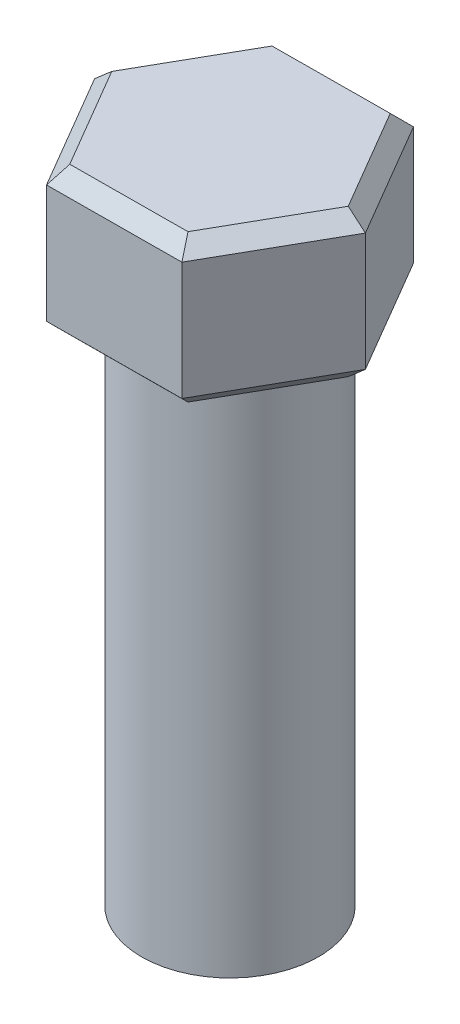
ISO-10303-21;
HEADER;
FILE_DESCRIPTION(('STEP AP214'),'2;1');
FILE_NAME('part.step','',(''),(''),'','','');
FILE_SCHEMA(('AUTOMOTIVE_DESIGN { 1 0 10303 214 1 1 1 1 }'));
ENDSEC;
DATA;
#1=APPLICATION_CONTEXT('core data for automotive mechanical design processes');
#2=APPLICATION_PROTOCOL_DEFINITION('international standard','automotive_design',2000,#1);
#3=PRODUCT_CONTEXT('',#1,'mechanical');
#4=PRODUCT('Part','Part','',(#3));
#5=PRODUCT_RELATED_PRODUCT_CATEGORY('part','',(#4));
#6=PRODUCT_DEFINITION_FORMATION('','',#4);
#7=PRODUCT_DEFINITION_CONTEXT('part definition',#1,'design');
#8=PRODUCT_DEFINITION('design','',#6,#7);
#9=PRODUCT_DEFINITION_SHAPE('','',#8);
#10=(LENGTH_UNIT() NAMED_UNIT(*) SI_UNIT(.MILLI.,.METRE.));
#11=(NAMED_UNIT(*) PLANE_ANGLE_UNIT() SI_UNIT($,.RADIAN.));
#12=(NAMED_UNIT(*) SI_UNIT($,.STERADIAN.) SOLID_ANGLE_UNIT());
#13=UNCERTAINTY_MEASURE_WITH_UNIT(LENGTH_MEASURE(1.E-05),#10,'distance_accuracy_value','');
#14=(GEOMETRIC_REPRESENTATION_CONTEXT(3) GLOBAL_UNCERTAINTY_ASSIGNED_CONTEXT((#13)) GLOBAL_UNIT_ASSIGNED_CONTEXT((#10,
#11,#12)) REPRESENTATION_CONTEXT('',''));
#15=CARTESIAN_POINT('',(0.,0.,0.));
#16=DIRECTION('',(0.,0.,1.));
#17=DIRECTION('',(1.,0.,0.));
#18=AXIS2_PLACEMENT_3D('',#15,#16,#17);
#19=CARTESIAN_POINT('',(0.,35.,0.));
#20=DIRECTION('',(0.,-1.,0.));
#21=DIRECTION('',(0.,0.,-1.));
#22=AXIS2_PLACEMENT_3D('',#19,#20,#21);
#23=CYLINDRICAL_SURFACE('',#22,6.);
#24=CARTESIAN_POINT('',(0.,35.,0.));
#25=DIRECTION('',(0.,1.,0.));
#26=DIRECTION('',(0.,0.,1.));
#27=AXIS2_PLACEMENT_3D('',#24,#25,#26);
#28=CIRCLE('',#27,6.);
#29=CARTESIAN_POINT('',(0.,35.,6.));
#30=VERTEX_POINT('',#29);
#31=EDGE_CURVE('E159',#30,#30,#28,.T.);
#32=ORIENTED_EDGE('',*,*,#31,.F.);
#33=EDGE_LOOP('',(#32));
#34=FACE_BOUND('',#33,.T.);
#35=CARTESIAN_POINT('',(0.,0.,0.));
#36=DIRECTION('',(0.,1.,0.));
#37=DIRECTION('',(0.,0.,1.));
#38=AXIS2_PLACEMENT_3D('',#35,#36,#37);
#39=CIRCLE('',#38,6.);
#40=CARTESIAN_POINT('',(0.,0.,6.));
#41=VERTEX_POINT('',#40);
#42=EDGE_CURVE('E230',#41,#41,#39,.T.);
#43=ORIENTED_EDGE('',*,*,#42,.T.);
#44=EDGE_LOOP('',(#43));
#45=FACE_BOUND('',#44,.T.);
#46=ADVANCED_FACE('F38',(#34,#45),#23,.T.);
#47=CARTESIAN_POINT('',(0.,0.,0.));
#48=DIRECTION('',(0.,1.,0.));
#49=DIRECTION('',(0.,0.,1.));
#50=AXIS2_PLACEMENT_3D('',#47,#48,#49);
#51=PLANE('',#50);
#52=ORIENTED_EDGE('',*,*,#42,.F.);
#53=EDGE_LOOP('',(#52));
#54=FACE_BOUND('',#53,.T.);
#55=ADVANCED_FACE('F308',(#54),#51,.F.);
#56=CARTESIAN_POINT('',(-4.50847310254012,45.,7.92363547695499));
#57=DIRECTION('',(-0.00629250078287666,0.,-0.999980202020969));
#58=DIRECTION('',(-0.999980202020969,0.,0.00629250078287666));
#59=AXIS2_PLACEMENT_3D('',#56,#57,#58);
#60=PLANE('',#59);
#61=DIRECTION('',(0.,-1.,0.));
#62=VECTOR('',#61,1.);
#63=CARTESIAN_POINT('',(-4.50847310254012,45.,7.92363547695499));
#64=LINE('',#63,#62);
#65=CARTESIAN_POINT('',(-4.50847310254012,44.,7.92363547695499));
#66=VERTEX_POINT('',#65);
#67=CARTESIAN_POINT('',(-4.50847310254012,36.,7.92363547695499));
#68=VERTEX_POINT('',#67);
#69=EDGE_CURVE('E180',#66,#68,#64,.T.);
#70=ORIENTED_EDGE('',*,*,#69,.T.);
#71=DIRECTION('',(0.999980202020969,0.,-0.00629250078287666));
#72=VECTOR('',#71,1.);
#73=CARTESIAN_POINT('',(-4.50847310254012,36.,7.92363547695499));
#74=LINE('',#73,#72);
#75=CARTESIAN_POINT('',(4.60783306210058,36.,7.86626997755609));
#76=VERTEX_POINT('',#75);
#77=EDGE_CURVE('E199',#68,#76,#74,.T.);
#78=ORIENTED_EDGE('',*,*,#77,.T.);
#79=DIRECTION('',(0.,-1.,0.));
#80=VECTOR('',#79,1.);
#81=CARTESIAN_POINT('',(4.60783306210058,45.,7.86626997755609));
#82=LINE('',#81,#80);
#83=CARTESIAN_POINT('',(4.60783306210058,44.,7.86626997755609));
#84=VERTEX_POINT('',#83);
#85=EDGE_CURVE('E150',#84,#76,#82,.T.);
#86=ORIENTED_EDGE('',*,*,#85,.F.);
#87=DIRECTION('',(-0.999980202020969,0.,0.00629250078287666));
#88=VECTOR('',#87,1.);
#89=CARTESIAN_POINT('',(-4.50847310254012,44.,7.92363547695499));
#90=LINE('',#89,#88);
#91=EDGE_CURVE('E201',#84,#66,#90,.T.);
#92=ORIENTED_EDGE('',*,*,#91,.T.);
#93=EDGE_LOOP('',(#70,#78,#86,#92));
#94=FACE_BOUND('',#93,.T.);
#95=ADVANCED_FACE('F247',(#94),#60,.F.);
#96=CARTESIAN_POINT('',(4.60783306210058,45.,7.86626997755609));
#97=DIRECTION('',(-0.869154508623093,0.,-0.494540635479179));
#98=DIRECTION('',(-0.494540635479179,0.,0.869154508623093));
#99=AXIS2_PLACEMENT_3D('',#96,#97,#98);
#100=PLANE('',#99);
#101=ORIENTED_EDGE('',*,*,#85,.T.);
#102=DIRECTION('',(0.494540635479179,0.,-0.869154508623093));
#103=VECTOR('',#102,1.);
#104=CARTESIAN_POINT('',(4.60783306210058,36.,7.86626997755609));
#105=LINE('',#104,#103);
#106=CARTESIAN_POINT('',(9.1163061646407,36.,-0.0573654993989019));
#107=VERTEX_POINT('',#106);
#108=EDGE_CURVE('E149',#76,#107,#105,.T.);
#109=ORIENTED_EDGE('',*,*,#108,.T.);
#110=DIRECTION('',(0.,-1.,0.));
#111=VECTOR('',#110,1.);
#112=CARTESIAN_POINT('',(9.1163061646407,45.,-0.0573654993989019));
#113=LINE('',#112,#111);
#114=CARTESIAN_POINT('',(9.1163061646407,44.,-0.0573654993989019));
#115=VERTEX_POINT('',#114);
#116=EDGE_CURVE('E132',#115,#107,#113,.T.);
#117=ORIENTED_EDGE('',*,*,#116,.F.);
#118=DIRECTION('',(-0.494540635479179,0.,0.869154508623093));
#119=VECTOR('',#118,1.);
#120=CARTESIAN_POINT('',(4.60783306210058,44.,7.86626997755609));
#121=LINE('',#120,#119);
#122=EDGE_CURVE('E146',#115,#84,#121,.T.);
#123=ORIENTED_EDGE('',*,*,#122,.T.);
#124=EDGE_LOOP('',(#101,#109,#117,#123));
#125=FACE_BOUND('',#124,.T.);
#126=ADVANCED_FACE('F145',(#125),#100,.F.);
#127=CARTESIAN_POINT('',(9.1163061646407,45.,-0.0573654993989019));
#128=DIRECTION('',(-0.862862007840215,0.,0.505439566541789));
#129=DIRECTION('',(0.505439566541789,0.,0.862862007840215));
#130=AXIS2_PLACEMENT_3D('',#127,#128,#129);
#131=PLANE('',#130);
#132=ORIENTED_EDGE('',*,*,#116,.T.);
#133=DIRECTION('',(-0.505439566541789,0.,-0.862862007840215));
#134=VECTOR('',#133,1.);
#135=CARTESIAN_POINT('',(9.1163061646407,36.,-0.0573654993989019));
#136=LINE('',#135,#134);
#137=CARTESIAN_POINT('',(4.50847310254012,36.,-7.92363547695499));
#138=VERTEX_POINT('',#137);
#139=EDGE_CURVE('E138',#107,#138,#136,.T.);
#140=ORIENTED_EDGE('',*,*,#139,.T.);
#141=DIRECTION('',(0.,-1.,0.));
#142=VECTOR('',#141,1.);
#143=CARTESIAN_POINT('',(4.50847310254012,45.,-7.92363547695499));
#144=LINE('',#143,#142);
#145=CARTESIAN_POINT('',(4.50847310254012,44.,-7.92363547695499));
#146=VERTEX_POINT('',#145);
#147=EDGE_CURVE('E134',#146,#138,#144,.T.);
#148=ORIENTED_EDGE('',*,*,#147,.F.);
#149=DIRECTION('',(0.505439566541789,0.,0.862862007840215));
#150=VECTOR('',#149,1.);
#151=CARTESIAN_POINT('',(9.1163061646407,44.,-0.057365499398902));
#152=LINE('',#151,#150);
#153=EDGE_CURVE('E129',#146,#115,#152,.T.);
#154=ORIENTED_EDGE('',*,*,#153,.T.);
#155=EDGE_LOOP('',(#132,#140,#148,#154));
#156=FACE_BOUND('',#155,.T.);
#157=ADVANCED_FACE('F131',(#156),#131,.F.);
#158=CARTESIAN_POINT('',(4.50847310254012,45.,-7.92363547695499));
#159=DIRECTION('',(0.00629250078287704,0.,0.999980202020969));
#160=DIRECTION('',(0.999980202020969,0.,-0.00629250078287704));
#161=AXIS2_PLACEMENT_3D('',#158,#159,#160);
#162=PLANE('',#161);
#163=ORIENTED_EDGE('',*,*,#147,.T.);
#164=DIRECTION('',(-0.999980202020969,0.,0.00629250078287704));
#165=VECTOR('',#164,1.);
#166=CARTESIAN_POINT('',(4.50847310254012,36.,-7.92363547695499));
#167=LINE('',#166,#165);
#168=CARTESIAN_POINT('',(-4.60783306210058,36.,-7.86626997755608));
#169=VERTEX_POINT('',#168);
#170=EDGE_CURVE('E212',#138,#169,#167,.T.);
#171=ORIENTED_EDGE('',*,*,#170,.T.);
#172=DIRECTION('',(0.,-1.,0.));
#173=VECTOR('',#172,1.);
#174=CARTESIAN_POINT('',(-4.60783306210058,45.,-7.86626997755608));
#175=LINE('',#174,#173);
#176=CARTESIAN_POINT('',(-4.60783306210058,44.,-7.86626997755608));
#177=VERTEX_POINT('',#176);
#178=EDGE_CURVE('E237',#177,#169,#175,.T.);
#179=ORIENTED_EDGE('',*,*,#178,.F.);
#180=DIRECTION('',(0.999980202020969,0.,-0.00629250078287704));
#181=VECTOR('',#180,1.);
#182=CARTESIAN_POINT('',(4.50847310254012,44.,-7.92363547695499));
#183=LINE('',#182,#181);
#184=EDGE_CURVE('E214',#177,#146,#183,.T.);
#185=ORIENTED_EDGE('',*,*,#184,.T.);
#186=EDGE_LOOP('',(#163,#171,#179,#185));
#187=FACE_BOUND('',#186,.T.);
#188=ADVANCED_FACE('F270',(#187),#162,.F.);
#189=CARTESIAN_POINT('',(-4.60783306210058,45.,-7.86626997755608));
#190=DIRECTION('',(0.869154508623093,0.,0.494540635479179));
#191=DIRECTION('',(0.494540635479179,0.,-0.869154508623093));
#192=AXIS2_PLACEMENT_3D('',#189,#190,#191);
#193=PLANE('',#192);
#194=ORIENTED_EDGE('',*,*,#178,.T.);
#195=DIRECTION('',(-0.494540635479179,0.,0.869154508623093));
#196=VECTOR('',#195,1.);
#197=CARTESIAN_POINT('',(-4.60783306210058,36.,-7.86626997755608));
#198=LINE('',#197,#196);
#199=CARTESIAN_POINT('',(-9.1163061646407,36.,0.0573654993989024));
#200=VERTEX_POINT('',#199);
#201=EDGE_CURVE('E207',#169,#200,#198,.T.);
#202=ORIENTED_EDGE('',*,*,#201,.T.);
#203=DIRECTION('',(0.,-1.,0.));
#204=VECTOR('',#203,1.);
#205=CARTESIAN_POINT('',(-9.1163061646407,45.,0.0573654993989024));
#206=LINE('',#205,#204);
#207=CARTESIAN_POINT('',(-9.1163061646407,44.,0.0573654993989024));
#208=VERTEX_POINT('',#207);
#209=EDGE_CURVE('E240',#208,#200,#206,.T.);
#210=ORIENTED_EDGE('',*,*,#209,.F.);
#211=DIRECTION('',(0.494540635479179,0.,-0.869154508623093));
#212=VECTOR('',#211,1.);
#213=CARTESIAN_POINT('',(-4.60783306210058,44.,-7.86626997755608));
#214=LINE('',#213,#212);
#215=EDGE_CURVE('E209',#208,#177,#214,.T.);
#216=ORIENTED_EDGE('',*,*,#215,.T.);
#217=EDGE_LOOP('',(#194,#202,#210,#216));
#218=FACE_BOUND('',#217,.T.);
#219=ADVANCED_FACE('F284',(#218),#193,.F.);
#220=CARTESIAN_POINT('',(-9.1163061646407,45.,0.0573654993989024));
#221=DIRECTION('',(0.862862007840215,0.,-0.50543956654179));
#222=DIRECTION('',(-0.50543956654179,0.,-0.862862007840215));
#223=AXIS2_PLACEMENT_3D('',#220,#221,#222);
#224=PLANE('',#223);
#225=ORIENTED_EDGE('',*,*,#209,.T.);
#226=DIRECTION('',(0.50543956654179,0.,0.862862007840215));
#227=VECTOR('',#226,1.);
#228=CARTESIAN_POINT('',(-9.1163061646407,36.,0.0573654993989024));
#229=LINE('',#228,#227);
#230=EDGE_CURVE('E203',#200,#68,#229,.T.);
#231=ORIENTED_EDGE('',*,*,#230,.T.);
#232=ORIENTED_EDGE('',*,*,#69,.F.);
#233=DIRECTION('',(-0.50543956654179,0.,-0.862862007840215));
#234=VECTOR('',#233,1.);
#235=CARTESIAN_POINT('',(-9.1163061646407,44.,0.0573654993989026));
#236=LINE('',#235,#234);
#237=EDGE_CURVE('E205',#66,#208,#236,.T.);
#238=ORIENTED_EDGE('',*,*,#237,.T.);
#239=EDGE_LOOP('',(#225,#231,#232,#238));
#240=FACE_BOUND('',#239,.T.);
#241=ADVANCED_FACE('F286',(#240),#224,.F.);
#242=CARTESIAN_POINT('',(0.,45.,0.));
#243=DIRECTION('',(0.,1.,0.));
#244=DIRECTION('',(0.,0.,1.));
#245=AXIS2_PLACEMENT_3D('',#242,#243,#244);
#246=PLANE('',#245);
#247=DIRECTION('',(-0.999980202020969,0.,0.00629250078287704));
#248=VECTOR('',#247,1.);
#249=CARTESIAN_POINT('',(-4.60154056131771,45.,-6.86628977553511));
#250=LINE('',#249,#248);
#251=CARTESIAN_POINT('',(3.93742676450189,45.,-6.92002229791315));
#252=VERTEX_POINT('',#251);
#253=CARTESIAN_POINT('',(-4.0242017224966,45.,-6.86992275255598));
#254=VERTEX_POINT('',#253);
#255=EDGE_CURVE('E48',#252,#254,#250,.T.);
#256=ORIENTED_EDGE('',*,*,#255,.T.);
#257=DIRECTION('',(-0.494540635479179,0.,0.869154508623093));
#258=VECTOR('',#257,1.);
#259=CARTESIAN_POINT('',(-8.24715165601761,45.,0.551906134878083));
#260=LINE('',#259,#258);
#261=CARTESIAN_POINT('',(-7.9616284869985,45.,0.0500995453571603));
#262=VERTEX_POINT('',#261);
#263=EDGE_CURVE('E11',#254,#262,#260,.T.);
#264=ORIENTED_EDGE('',*,*,#263,.T.);
#265=DIRECTION('',(0.50543956654179,0.,0.862862007840215));
#266=VECTOR('',#265,1.);
#267=CARTESIAN_POINT('',(-3.6456110946999,45.,7.4181959104132));
#268=LINE('',#267,#266);
#269=CARTESIAN_POINT('',(-3.93742676450189,45.,6.92002229791315));
#270=VERTEX_POINT('',#269);
#271=EDGE_CURVE('E197',#262,#270,#268,.T.);
#272=ORIENTED_EDGE('',*,*,#271,.T.);
#273=DIRECTION('',(0.999980202020969,0.,-0.00629250078287666));
#274=VECTOR('',#273,1.);
#275=CARTESIAN_POINT('',(4.60154056131771,45.,6.86628977553512));
#276=LINE('',#275,#274);
#277=CARTESIAN_POINT('',(4.0242017224966,45.,6.86992275255599));
#278=VERTEX_POINT('',#277);
#279=EDGE_CURVE('E195',#270,#278,#276,.T.);
#280=ORIENTED_EDGE('',*,*,#279,.T.);
#281=DIRECTION('',(0.494540635479179,0.,-0.869154508623093));
#282=VECTOR('',#281,1.);
#283=CARTESIAN_POINT('',(8.24715165601761,45.,-0.551906134878082));
#284=LINE('',#283,#282);
#285=CARTESIAN_POINT('',(7.9616284869985,45.,-0.0500995453571602));
#286=VERTEX_POINT('',#285);
#287=EDGE_CURVE('E193',#278,#286,#284,.T.);
#288=ORIENTED_EDGE('',*,*,#287,.T.);
#289=DIRECTION('',(-0.505439566541789,0.,-0.862862007840215));
#290=VECTOR('',#289,1.);
#291=CARTESIAN_POINT('',(3.6456110946999,45.,-7.4181959104132));
#292=LINE('',#291,#290);
#293=EDGE_CURVE('E59',#286,#252,#292,.T.);
#294=ORIENTED_EDGE('',*,*,#293,.T.);
#295=EDGE_LOOP('',(#256,#264,#272,#280,#288,#294));
#296=FACE_BOUND('',#295,.T.);
#297=ADVANCED_FACE('F404',(#296),#246,.T.);
#298=CARTESIAN_POINT('',(0.,35.,0.));
#299=DIRECTION('',(0.,1.,0.));
#300=DIRECTION('',(0.,0.,1.));
#301=AXIS2_PLACEMENT_3D('',#298,#299,#300);
#302=PLANE('',#301);
#303=DIRECTION('',(0.505439566541789,0.,0.862862007840215));
#304=VECTOR('',#303,1.);
#305=CARTESIAN_POINT('',(5.94952762575019,35.,-3.48506092163515));
#306=LINE('',#305,#304);
#307=CARTESIAN_POINT('',(3.93742676450189,35.,-6.92002229791314));
#308=VERTEX_POINT('',#307);
#309=CARTESIAN_POINT('',(7.96162848699849,35.,-0.0500995453571616));
#310=VERTEX_POINT('',#309);
#311=EDGE_CURVE('E219',#308,#310,#306,.T.);
#312=ORIENTED_EDGE('',*,*,#311,.T.);
#313=DIRECTION('',(-0.494540635479179,0.,0.869154508623093));
#314=VECTOR('',#313,1.);
#315=CARTESIAN_POINT('',(5.99291510474755,35.,3.40991160359941));
#316=LINE('',#315,#314);
#317=CARTESIAN_POINT('',(4.0242017224966,35.,6.86992275255598));
#318=VERTEX_POINT('',#317);
#319=EDGE_CURVE('E139',#310,#318,#316,.T.);
#320=ORIENTED_EDGE('',*,*,#319,.T.);
#321=DIRECTION('',(-0.999980202020969,0.,0.00629250078287666));
#322=VECTOR('',#321,1.);
#323=CARTESIAN_POINT('',(0.043387478997351,35.,6.89497252523456));
#324=LINE('',#323,#322);
#325=CARTESIAN_POINT('',(-3.93742676450189,35.,6.92002229791314));
#326=VERTEX_POINT('',#325);
#327=EDGE_CURVE('E227',#318,#326,#324,.T.);
#328=ORIENTED_EDGE('',*,*,#327,.T.);
#329=DIRECTION('',(-0.50543956654179,0.,-0.862862007840215));
#330=VECTOR('',#329,1.);
#331=CARTESIAN_POINT('',(-5.94952762575019,35.,3.48506092163515));
#332=LINE('',#331,#330);
#333=CARTESIAN_POINT('',(-7.96162848699849,35.,0.0500995453571641));
#334=VERTEX_POINT('',#333);
#335=EDGE_CURVE('E225',#326,#334,#332,.T.);
#336=ORIENTED_EDGE('',*,*,#335,.T.);
#337=DIRECTION('',(0.494540635479179,0.,-0.869154508623093));
#338=VECTOR('',#337,1.);
#339=CARTESIAN_POINT('',(-5.99291510474755,35.,-3.40991160359941));
#340=LINE('',#339,#338);
#341=CARTESIAN_POINT('',(-4.0242017224966,35.,-6.86992275255598));
#342=VERTEX_POINT('',#341);
#343=EDGE_CURVE('E223',#334,#342,#340,.T.);
#344=ORIENTED_EDGE('',*,*,#343,.T.);
#345=DIRECTION('',(0.999980202020969,0.,-0.00629250078287704));
#346=VECTOR('',#345,1.);
#347=CARTESIAN_POINT('',(-0.0433874789973536,35.,-6.89497252523456));
#348=LINE('',#347,#346);
#349=EDGE_CURVE('E221',#342,#308,#348,.T.);
#350=ORIENTED_EDGE('',*,*,#349,.T.);
#351=EDGE_LOOP('',(#312,#320,#328,#336,#344,#350));
#352=FACE_BOUND('',#351,.T.);
#353=ORIENTED_EDGE('',*,*,#31,.T.);
#354=EDGE_LOOP('',(#353));
#355=FACE_BOUND('',#354,.T.);
#356=ADVANCED_FACE('F350',(#352,#355),#302,.F.);
#357=CARTESIAN_POINT('',(-4.60783306210058,36.,-7.86626997755608));
#358=DIRECTION('',(0.614585046946246,0.707106781186552,0.34969303691963));
#359=DIRECTION('',(-0.494540635479179,0.,0.869154508623093));
#360=AXIS2_PLACEMENT_3D('',#357,#358,#359);
#361=PLANE('',#360);
#362=DIRECTION('',(0.382076398811962,-0.654653670707973,0.652262368146024));
#363=VECTOR('',#362,1.);
#364=CARTESIAN_POINT('',(-4.60783306210058,36.,-7.86626997755608));
#365=LINE('',#364,#363);
#366=EDGE_CURVE('E181',#342,#169,#365,.F.);
#367=ORIENTED_EDGE('',*,*,#366,.F.);
#368=ORIENTED_EDGE('',*,*,#343,.F.);
#369=DIRECTION('',(0.755913980153036,-0.654653670707973,-0.00475668348461975));
#370=VECTOR('',#369,1.);
#371=CARTESIAN_POINT('',(-9.1163061646407,36.,0.0573654993989024));
#372=LINE('',#371,#370);
#373=EDGE_CURVE('E177',#200,#334,#372,.T.);
#374=ORIENTED_EDGE('',*,*,#373,.F.);
#375=ORIENTED_EDGE('',*,*,#201,.F.);
#376=EDGE_LOOP('',(#367,#368,#374,#375));
#377=FACE_BOUND('',#376,.T.);
#378=ADVANCED_FACE('F280',(#377),#361,.F.);
#379=CARTESIAN_POINT('',(-9.1163061646407,36.,0.0573654993989024));
#380=DIRECTION('',(0.610135576972053,0.707106781186552,-0.357399744981686));
#381=DIRECTION('',(0.50543956654179,0.,0.862862007840215));
#382=AXIS2_PLACEMENT_3D('',#379,#380,#381);
#383=PLANE('',#382);
#384=ORIENTED_EDGE('',*,*,#373,.T.);
#385=ORIENTED_EDGE('',*,*,#335,.F.);
#386=DIRECTION('',(0.373837581341075,-0.654653670707973,-0.657019051630645));
#387=VECTOR('',#386,1.);
#388=CARTESIAN_POINT('',(-4.50847310254012,36.,7.92363547695499));
#389=LINE('',#388,#387);
#390=EDGE_CURVE('E184',#68,#326,#389,.T.);
#391=ORIENTED_EDGE('',*,*,#390,.F.);
#392=ORIENTED_EDGE('',*,*,#230,.F.);
#393=EDGE_LOOP('',(#384,#385,#391,#392));
#394=FACE_BOUND('',#393,.T.);
#395=ADVANCED_FACE('F254',(#394),#383,.F.);
#396=CARTESIAN_POINT('',(4.50847310254012,36.,-7.92363547695499));
#397=DIRECTION('',(0.00444946997419399,0.707106781186551,0.707092781901317));
#398=DIRECTION('',(-0.999980202020969,0.,0.00629250078287704));
#399=AXIS2_PLACEMENT_3D('',#396,#397,#398);
#400=PLANE('',#399);
#401=ORIENTED_EDGE('',*,*,#366,.T.);
#402=ORIENTED_EDGE('',*,*,#170,.F.);
#403=DIRECTION('',(-0.373837581341074,-0.654653670707973,0.657019051630645));
#404=VECTOR('',#403,1.);
#405=CARTESIAN_POINT('',(4.50847310254012,36.,-7.92363547695499));
#406=LINE('',#405,#404);
#407=EDGE_CURVE('E187',#308,#138,#406,.F.);
#408=ORIENTED_EDGE('',*,*,#407,.F.);
#409=ORIENTED_EDGE('',*,*,#349,.F.);
#410=EDGE_LOOP('',(#401,#402,#408,#409));
#411=FACE_BOUND('',#410,.T.);
#412=ADVANCED_FACE('F274',(#411),#400,.F.);
#413=CARTESIAN_POINT('',(-4.50847310254012,36.,7.92363547695499));
#414=DIRECTION('',(-0.00444946997419372,0.707106781186551,-0.707092781901317));
#415=DIRECTION('',(0.999980202020969,0.,-0.00629250078287666));
#416=AXIS2_PLACEMENT_3D('',#413,#414,#415);
#417=PLANE('',#416);
#418=ORIENTED_EDGE('',*,*,#390,.T.);
#419=ORIENTED_EDGE('',*,*,#327,.F.);
#420=DIRECTION('',(0.382076398811961,0.654653670707973,0.652262368146025));
#421=VECTOR('',#420,1.);
#422=CARTESIAN_POINT('',(3.29130933007183,33.7442545615832,5.6187642696829));
#423=LINE('',#422,#421);
#424=EDGE_CURVE('E163',#76,#318,#423,.F.);
#425=ORIENTED_EDGE('',*,*,#424,.F.);
#426=ORIENTED_EDGE('',*,*,#77,.F.);
#427=EDGE_LOOP('',(#418,#419,#425,#426));
#428=FACE_BOUND('',#427,.T.);
#429=ADVANCED_FACE('F258',(#428),#417,.F.);
#430=CARTESIAN_POINT('',(9.1163061646407,36.,-0.0573654993989019));
#431=DIRECTION('',(-0.610135576972053,0.707106781186551,0.357399744981686));
#432=DIRECTION('',(-0.505439566541789,0.,-0.862862007840215));
#433=AXIS2_PLACEMENT_3D('',#430,#431,#432);
#434=PLANE('',#433);
#435=ORIENTED_EDGE('',*,*,#407,.T.);
#436=ORIENTED_EDGE('',*,*,#139,.F.);
#437=DIRECTION('',(-0.755913980153036,-0.654653670707973,0.00475668348462095));
#438=VECTOR('',#437,1.);
#439=CARTESIAN_POINT('',(9.1163061646407,36.,-0.0573654993989019));
#440=LINE('',#439,#438);
#441=EDGE_CURVE('E162',#310,#107,#440,.F.);
#442=ORIENTED_EDGE('',*,*,#441,.F.);
#443=ORIENTED_EDGE('',*,*,#311,.F.);
#444=EDGE_LOOP('',(#435,#436,#442,#443));
#445=FACE_BOUND('',#444,.T.);
#446=ADVANCED_FACE('F266',(#445),#434,.F.);
#447=CARTESIAN_POINT('',(4.60783306210058,36.,7.86626997755609));
#448=DIRECTION('',(-0.614585046946247,0.707106781186551,-0.34969303691963));
#449=DIRECTION('',(0.494540635479179,0.,-0.869154508623093));
#450=AXIS2_PLACEMENT_3D('',#447,#448,#449);
#451=PLANE('',#450);
#452=ORIENTED_EDGE('',*,*,#424,.T.);
#453=ORIENTED_EDGE('',*,*,#319,.F.);
#454=ORIENTED_EDGE('',*,*,#441,.T.);
#455=ORIENTED_EDGE('',*,*,#108,.F.);
#456=EDGE_LOOP('',(#452,#453,#454,#455));
#457=FACE_BOUND('',#456,.T.);
#458=ADVANCED_FACE('F261',(#457),#451,.F.);
#459=CARTESIAN_POINT('',(5.99291510474755,45.,3.40991160359941));
#460=DIRECTION('',(0.614585046946251,0.707106781186547,0.349693036919632));
#461=DIRECTION('',(-0.494540635479179,0.,0.869154508623093));
#462=AXIS2_PLACEMENT_3D('',#459,#460,#461);
#463=PLANE('',#462);
#464=DIRECTION('',(-0.382076398811959,0.654653670707977,-0.652262368146022));
#465=VECTOR('',#464,1.);
#466=CARTESIAN_POINT('',(3.44931576213995,45.9850155763512,5.88850521647656));
#467=LINE('',#466,#465);
#468=EDGE_CURVE('E157',#84,#278,#467,.T.);
#469=ORIENTED_EDGE('',*,*,#468,.F.);
#470=ORIENTED_EDGE('',*,*,#122,.F.);
#471=DIRECTION('',(-0.755913980153032,0.654653670707977,0.00475668348462169));
#472=VECTOR('',#471,1.);
#473=CARTESIAN_POINT('',(6.82425298885585,45.9850155763512,-0.0429424674489942));
#474=LINE('',#473,#472);
#475=EDGE_CURVE('E43',#286,#115,#474,.F.);
#476=ORIENTED_EDGE('',*,*,#475,.F.);
#477=ORIENTED_EDGE('',*,*,#287,.F.);
#478=EDGE_LOOP('',(#469,#470,#476,#477));
#479=FACE_BOUND('',#478,.T.);
#480=ADVANCED_FACE('F41',(#479),#463,.T.);
#481=CARTESIAN_POINT('',(5.9495276257502,45.,-3.48506092163515));
#482=DIRECTION('',(0.610135576972056,0.707106781186548,-0.357399744981688));
#483=DIRECTION('',(0.505439566541789,0.,0.862862007840215));
#484=AXIS2_PLACEMENT_3D('',#481,#482,#483);
#485=PLANE('',#484);
#486=ORIENTED_EDGE('',*,*,#475,.T.);
#487=ORIENTED_EDGE('',*,*,#153,.F.);
#488=DIRECTION('',(-0.373837581341073,0.654653670707977,0.657019051630642));
#489=VECTOR('',#488,1.);
#490=CARTESIAN_POINT('',(3.37493722671591,45.9850155763512,-5.93144768392555));
#491=LINE('',#490,#489);
#492=EDGE_CURVE('E165',#252,#146,#491,.F.);
#493=ORIENTED_EDGE('',*,*,#492,.F.);
#494=ORIENTED_EDGE('',*,*,#293,.F.);
#495=EDGE_LOOP('',(#486,#487,#493,#494));
#496=FACE_BOUND('',#495,.T.);
#497=ADVANCED_FACE('F161',(#496),#485,.T.);
#498=CARTESIAN_POINT('',(0.043387478997351,45.,6.89497252523457));
#499=DIRECTION('',(0.00444946997419374,0.707106781186548,0.70709278190132));
#500=DIRECTION('',(-0.999980202020969,0.,0.00629250078287666));
#501=AXIS2_PLACEMENT_3D('',#498,#499,#500);
#502=PLANE('',#501);
#503=ORIENTED_EDGE('',*,*,#468,.T.);
#504=ORIENTED_EDGE('',*,*,#279,.F.);
#505=DIRECTION('',(0.373837581341073,0.654653670707977,-0.657019051630642));
#506=VECTOR('',#505,1.);
#507=CARTESIAN_POINT('',(-3.37493722671591,45.9850155763512,5.93144768392555));
#508=LINE('',#507,#506);
#509=EDGE_CURVE('E168',#66,#270,#508,.T.);
#510=ORIENTED_EDGE('',*,*,#509,.F.);
#511=ORIENTED_EDGE('',*,*,#91,.F.);
#512=EDGE_LOOP('',(#503,#504,#510,#511));
#513=FACE_BOUND('',#512,.T.);
#514=ADVANCED_FACE('F298',(#513),#502,.T.);
#515=CARTESIAN_POINT('',(-0.0433874789973536,45.,-6.89497252523456));
#516=DIRECTION('',(-0.00444946997419401,0.707106781186548,-0.70709278190132));
#517=DIRECTION('',(0.999980202020969,0.,-0.00629250078287704));
#518=AXIS2_PLACEMENT_3D('',#515,#516,#517);
#519=PLANE('',#518);
#520=ORIENTED_EDGE('',*,*,#492,.T.);
#521=ORIENTED_EDGE('',*,*,#184,.F.);
#522=DIRECTION('',(0.382076398811959,0.654653670707977,0.652262368146022));
#523=VECTOR('',#522,1.);
#524=CARTESIAN_POINT('',(-3.44931576213995,45.9850155763512,-5.88850521647656));
#525=LINE('',#524,#523);
#526=EDGE_CURVE('E173',#254,#177,#525,.F.);
#527=ORIENTED_EDGE('',*,*,#526,.F.);
#528=ORIENTED_EDGE('',*,*,#255,.F.);
#529=EDGE_LOOP('',(#520,#521,#527,#528));
#530=FACE_BOUND('',#529,.T.);
#531=ADVANCED_FACE('F296',(#530),#519,.T.);
#532=CARTESIAN_POINT('',(-5.94952762575019,45.,3.48506092163515));
#533=DIRECTION('',(-0.610135576972056,0.707106781186548,0.357399744981688));
#534=DIRECTION('',(-0.50543956654179,0.,-0.862862007840215));
#535=AXIS2_PLACEMENT_3D('',#532,#533,#534);
#536=PLANE('',#535);
#537=ORIENTED_EDGE('',*,*,#509,.T.);
#538=ORIENTED_EDGE('',*,*,#271,.F.);
#539=DIRECTION('',(-0.755913980153032,-0.654653670707977,0.00475668348462175));
#540=VECTOR('',#539,1.);
#541=CARTESIAN_POINT('',(-6.82425298885586,45.9850155763512,0.0429424674489938));
#542=LINE('',#541,#540);
#543=EDGE_CURVE('E175',#208,#262,#542,.F.);
#544=ORIENTED_EDGE('',*,*,#543,.F.);
#545=ORIENTED_EDGE('',*,*,#237,.F.);
#546=EDGE_LOOP('',(#537,#538,#544,#545));
#547=FACE_BOUND('',#546,.T.);
#548=ADVANCED_FACE('F290',(#547),#536,.T.);
#549=CARTESIAN_POINT('',(-5.99291510474755,45.,-3.40991160359941));
#550=DIRECTION('',(-0.61458504694625,0.707106781186547,-0.349693036919632));
#551=DIRECTION('',(0.494540635479179,0.,-0.869154508623093));
#552=AXIS2_PLACEMENT_3D('',#549,#550,#551);
#553=PLANE('',#552);
#554=ORIENTED_EDGE('',*,*,#526,.T.);
#555=ORIENTED_EDGE('',*,*,#215,.F.);
#556=ORIENTED_EDGE('',*,*,#543,.T.);
#557=ORIENTED_EDGE('',*,*,#263,.F.);
#558=EDGE_LOOP('',(#554,#555,#556,#557));
#559=FACE_BOUND('',#558,.T.);
#560=ADVANCED_FACE('F294',(#559),#553,.T.);
#561=CLOSED_SHELL('',(#46,#55,#95,#126,#157,#188,#219,#241,#297,#356,#378,#395,#412,#429,#446,
#458,#480,#497,#514,#531,#548,#560));
#562=MANIFOLD_SOLID_BREP('B2',#561);
#563=ADVANCED_BREP_SHAPE_REPRESENTATION('',(#18,#562),#14);
#564=SHAPE_DEFINITION_REPRESENTATION(#9,#563);
ENDSEC;
END-ISO-10303-21;
